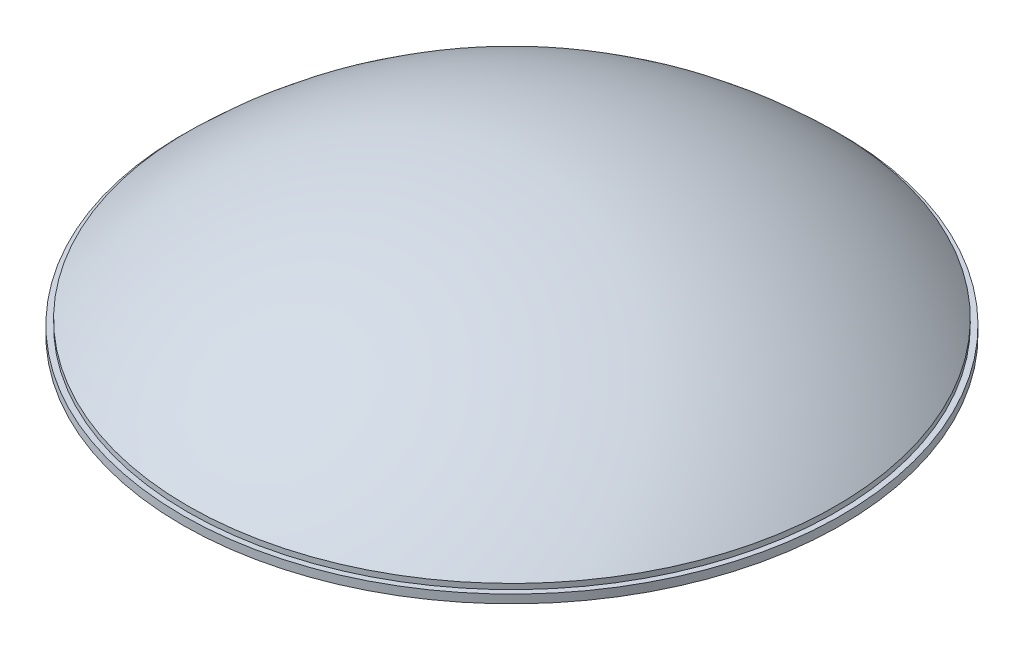
ISO-10303-21;
HEADER;
FILE_DESCRIPTION(('STEP AP214'),'2;1');
FILE_NAME('part.step','',(''),(''),'','','');
FILE_SCHEMA(('AUTOMOTIVE_DESIGN { 1 0 10303 214 1 1 1 1 }'));
ENDSEC;
DATA;
#1=APPLICATION_CONTEXT('core data for automotive mechanical design processes');
#2=APPLICATION_PROTOCOL_DEFINITION('international standard','automotive_design',2000,#1);
#3=PRODUCT_CONTEXT('',#1,'mechanical');
#4=PRODUCT('Part','Part','',(#3));
#5=PRODUCT_RELATED_PRODUCT_CATEGORY('part','',(#4));
#6=PRODUCT_DEFINITION_FORMATION('','',#4);
#7=PRODUCT_DEFINITION_CONTEXT('part definition',#1,'design');
#8=PRODUCT_DEFINITION('design','',#6,#7);
#9=PRODUCT_DEFINITION_SHAPE('','',#8);
#10=(LENGTH_UNIT() NAMED_UNIT(*) SI_UNIT(.MILLI.,.METRE.));
#11=(NAMED_UNIT(*) PLANE_ANGLE_UNIT() SI_UNIT($,.RADIAN.));
#12=(NAMED_UNIT(*) SI_UNIT($,.STERADIAN.) SOLID_ANGLE_UNIT());
#13=UNCERTAINTY_MEASURE_WITH_UNIT(LENGTH_MEASURE(1.E-05),#10,'distance_accuracy_value','');
#14=(GEOMETRIC_REPRESENTATION_CONTEXT(3) GLOBAL_UNCERTAINTY_ASSIGNED_CONTEXT((#13)) GLOBAL_UNIT_ASSIGNED_CONTEXT((#10,
#11,#12)) REPRESENTATION_CONTEXT('',''));
#15=CARTESIAN_POINT('',(0.,0.,0.));
#16=DIRECTION('',(0.,0.,1.));
#17=DIRECTION('',(1.,0.,0.));
#18=AXIS2_PLACEMENT_3D('',#15,#16,#17);
#19=CARTESIAN_POINT('',(0.,0.,0.));
#20=DIRECTION('',(0.,1.,0.));
#21=DIRECTION('',(0.,0.,-1.));
#22=AXIS2_PLACEMENT_3D('',#19,#20,#21);
#23=SPHERICAL_SURFACE('',#22,342.);
#24=CARTESIAN_POINT('',(0.,245.115788965134,0.));
#25=DIRECTION('',(0.,1.,0.));
#26=DIRECTION('',(0.,0.,1.));
#27=AXIS2_PLACEMENT_3D('',#24,#25,#26);
#28=CIRCLE('',#27,238.5);
#29=CARTESIAN_POINT('',(0.,245.115788965134,238.5));
#30=VERTEX_POINT('',#29);
#31=EDGE_CURVE('E54',#30,#30,#28,.T.);
#32=ORIENTED_EDGE('',*,*,#31,.T.);
#33=EDGE_LOOP('',(#32));
#34=FACE_BOUND('',#33,.T.);
#35=ADVANCED_FACE('F35',(#34),#23,.T.);
#36=CARTESIAN_POINT('',(0.,0.,0.));
#37=DIRECTION('',(0.,1.,0.));
#38=DIRECTION('',(0.,0.,1.));
#39=AXIS2_PLACEMENT_3D('',#36,#37,#38);
#40=SPHERICAL_SURFACE('',#39,332.);
#41=CARTESIAN_POINT('',(0.,234.956089799648,0.));
#42=DIRECTION('',(0.,1.,0.));
#43=DIRECTION('',(0.,0.,1.));
#44=AXIS2_PLACEMENT_3D('',#41,#42,#43);
#45=CIRCLE('',#44,234.562648062431);
#46=CARTESIAN_POINT('',(0.,234.956089799648,234.562648062431));
#47=VERTEX_POINT('',#46);
#48=EDGE_CURVE('E10',#47,#47,#45,.T.);
#49=ORIENTED_EDGE('',*,*,#48,.F.);
#50=EDGE_LOOP('',(#49));
#51=FACE_BOUND('',#50,.T.);
#52=ADVANCED_FACE('F78',(#51),#40,.F.);
#53=CARTESIAN_POINT('',(0.,234.956089799648,-242.5));
#54=DIRECTION('',(0.,1.,0.));
#55=DIRECTION('',(0.,0.,1.));
#56=AXIS2_PLACEMENT_3D('',#53,#54,#55);
#57=PLANE('',#56);
#58=CARTESIAN_POINT('',(0.,234.956089799648,0.));
#59=DIRECTION('',(0.,1.,0.));
#60=DIRECTION('',(0.,0.,1.));
#61=AXIS2_PLACEMENT_3D('',#58,#59,#60);
#62=CIRCLE('',#61,242.5);
#63=CARTESIAN_POINT('',(0.,234.956089799648,242.5));
#64=VERTEX_POINT('',#63);
#65=EDGE_CURVE('E41',#64,#64,#62,.T.);
#66=ORIENTED_EDGE('',*,*,#65,.F.);
#67=EDGE_LOOP('',(#66));
#68=FACE_BOUND('',#67,.T.);
#69=ORIENTED_EDGE('',*,*,#48,.T.);
#70=EDGE_LOOP('',(#69));
#71=FACE_BOUND('',#70,.T.);
#72=ADVANCED_FACE('F73',(#68,#71),#57,.F.);
#73=CARTESIAN_POINT('',(0.,342.,0.));
#74=DIRECTION('',(0.,1.,0.));
#75=DIRECTION('',(0.,0.,1.));
#76=AXIS2_PLACEMENT_3D('',#73,#74,#75);
#77=CYLINDRICAL_SURFACE('',#76,242.5);
#78=CARTESIAN_POINT('',(0.,241.15917979625,0.));
#79=DIRECTION('',(0.,1.,0.));
#80=DIRECTION('',(0.,0.,1.));
#81=AXIS2_PLACEMENT_3D('',#78,#79,#80);
#82=CIRCLE('',#81,242.5);
#83=CARTESIAN_POINT('',(0.,241.15917979625,242.5));
#84=VERTEX_POINT('',#83);
#85=EDGE_CURVE('E45',#84,#84,#82,.T.);
#86=ORIENTED_EDGE('',*,*,#85,.F.);
#87=EDGE_LOOP('',(#86));
#88=FACE_BOUND('',#87,.T.);
#89=ORIENTED_EDGE('',*,*,#65,.T.);
#90=EDGE_LOOP('',(#89));
#91=FACE_BOUND('',#90,.T.);
#92=ADVANCED_FACE('F68',(#88,#91),#77,.T.);
#93=CARTESIAN_POINT('',(0.,241.15917979625,-242.5));
#94=DIRECTION('',(0.,-1.,0.));
#95=DIRECTION('',(0.,0.,-1.));
#96=AXIS2_PLACEMENT_3D('',#93,#94,#95);
#97=PLANE('',#96);
#98=CARTESIAN_POINT('',(0.,241.15917979625,0.));
#99=DIRECTION('',(0.,1.,0.));
#100=DIRECTION('',(0.,0.,1.));
#101=AXIS2_PLACEMENT_3D('',#98,#99,#100);
#102=CIRCLE('',#101,238.5);
#103=CARTESIAN_POINT('',(0.,241.15917979625,238.5));
#104=VERTEX_POINT('',#103);
#105=EDGE_CURVE('E49',#104,#104,#102,.T.);
#106=ORIENTED_EDGE('',*,*,#105,.F.);
#107=EDGE_LOOP('',(#106));
#108=FACE_BOUND('',#107,.T.);
#109=ORIENTED_EDGE('',*,*,#85,.T.);
#110=EDGE_LOOP('',(#109));
#111=FACE_BOUND('',#110,.T.);
#112=ADVANCED_FACE('F62',(#108,#111),#97,.F.);
#113=CARTESIAN_POINT('',(0.,342.,0.));
#114=DIRECTION('',(0.,1.,0.));
#115=DIRECTION('',(0.,0.,1.));
#116=AXIS2_PLACEMENT_3D('',#113,#114,#115);
#117=CYLINDRICAL_SURFACE('',#116,238.5);
#118=ORIENTED_EDGE('',*,*,#31,.F.);
#119=EDGE_LOOP('',(#118));
#120=FACE_BOUND('',#119,.T.);
#121=ORIENTED_EDGE('',*,*,#105,.T.);
#122=EDGE_LOOP('',(#121));
#123=FACE_BOUND('',#122,.T.);
#124=ADVANCED_FACE('F59',(#120,#123),#117,.T.);
#125=CLOSED_SHELL('',(#35,#52,#72,#92,#112,#124));
#126=MANIFOLD_SOLID_BREP('B2',#125);
#127=ADVANCED_BREP_SHAPE_REPRESENTATION('',(#18,#126),#14);
#128=SHAPE_DEFINITION_REPRESENTATION(#9,#127);
ENDSEC;
END-ISO-10303-21;
